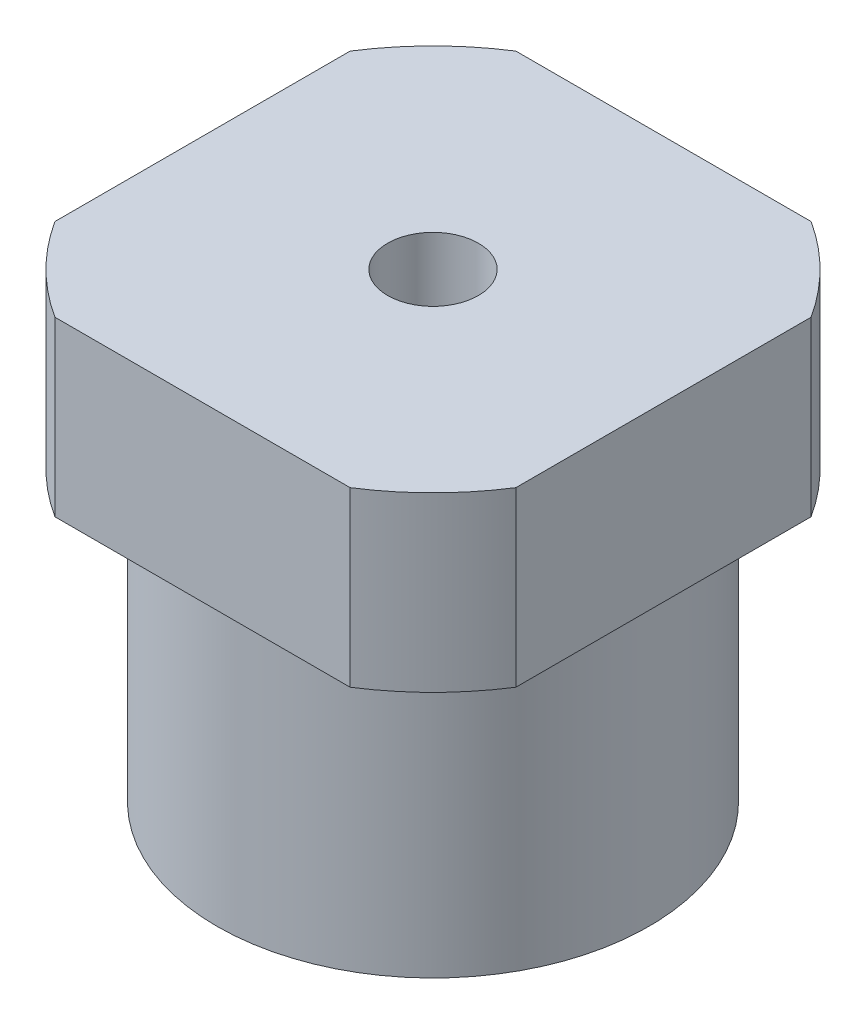
ISO-10303-21;
HEADER;
FILE_DESCRIPTION(('STEP AP214'),'2;1');
FILE_NAME('part.step','',(''),(''),'','','');
FILE_SCHEMA(('AUTOMOTIVE_DESIGN { 1 0 10303 214 1 1 1 1 }'));
ENDSEC;
DATA;
#1=APPLICATION_CONTEXT('core data for automotive mechanical design processes');
#2=APPLICATION_PROTOCOL_DEFINITION('international standard','automotive_design',2000,#1);
#3=PRODUCT_CONTEXT('',#1,'mechanical');
#4=PRODUCT('Part','Part','',(#3));
#5=PRODUCT_RELATED_PRODUCT_CATEGORY('part','',(#4));
#6=PRODUCT_DEFINITION_FORMATION('','',#4);
#7=PRODUCT_DEFINITION_CONTEXT('part definition',#1,'design');
#8=PRODUCT_DEFINITION('design','',#6,#7);
#9=PRODUCT_DEFINITION_SHAPE('','',#8);
#10=(LENGTH_UNIT() NAMED_UNIT(*) SI_UNIT(.MILLI.,.METRE.));
#11=(NAMED_UNIT(*) PLANE_ANGLE_UNIT() SI_UNIT($,.RADIAN.));
#12=(NAMED_UNIT(*) SI_UNIT($,.STERADIAN.) SOLID_ANGLE_UNIT());
#13=UNCERTAINTY_MEASURE_WITH_UNIT(LENGTH_MEASURE(1.E-05),#10,'distance_accuracy_value','');
#14=(GEOMETRIC_REPRESENTATION_CONTEXT(3) GLOBAL_UNCERTAINTY_ASSIGNED_CONTEXT((#13)) GLOBAL_UNIT_ASSIGNED_CONTEXT((#10,
#11,#12)) REPRESENTATION_CONTEXT('',''));
#15=CARTESIAN_POINT('',(0.,0.,0.));
#16=DIRECTION('',(0.,0.,1.));
#17=DIRECTION('',(1.,0.,0.));
#18=AXIS2_PLACEMENT_3D('',#15,#16,#17);
#19=CARTESIAN_POINT('',(10.16,20.32,-10.16));
#20=DIRECTION('',(-1.,0.,0.));
#21=DIRECTION('',(0.,0.,1.));
#22=AXIS2_PLACEMENT_3D('',#19,#20,#21);
#23=PLANE('',#22);
#24=DIRECTION('',(0.,1.,0.));
#25=VECTOR('',#24,1.);
#26=CARTESIAN_POINT('',(10.16,0.,6.50681373638434));
#27=LINE('',#26,#25);
#28=CARTESIAN_POINT('',(10.16,12.7,6.50681373638434));
#29=VERTEX_POINT('',#28);
#30=CARTESIAN_POINT('',(10.16,20.32,6.50681373638434));
#31=VERTEX_POINT('',#30);
#32=EDGE_CURVE('E109',#29,#31,#27,.T.);
#33=ORIENTED_EDGE('',*,*,#32,.F.);
#34=DIRECTION('',(0.,0.,-1.));
#35=VECTOR('',#34,1.);
#36=CARTESIAN_POINT('',(10.16,12.7,-10.16));
#37=LINE('',#36,#35);
#38=CARTESIAN_POINT('',(10.16,12.7,-6.50681373638434));
#39=VERTEX_POINT('',#38);
#40=EDGE_CURVE('E117',#29,#39,#37,.T.);
#41=ORIENTED_EDGE('',*,*,#40,.T.);
#42=DIRECTION('',(0.,1.,0.));
#43=VECTOR('',#42,1.);
#44=CARTESIAN_POINT('',(10.16,0.,-6.50681373638434));
#45=LINE('',#44,#43);
#46=CARTESIAN_POINT('',(10.16,20.32,-6.50681373638434));
#47=VERTEX_POINT('',#46);
#48=EDGE_CURVE('E101',#39,#47,#45,.T.);
#49=ORIENTED_EDGE('',*,*,#48,.T.);
#50=DIRECTION('',(0.,0.,-1.));
#51=VECTOR('',#50,1.);
#52=CARTESIAN_POINT('',(10.16,20.32,-10.16));
#53=LINE('',#52,#51);
#54=EDGE_CURVE('E115',#31,#47,#53,.T.);
#55=ORIENTED_EDGE('',*,*,#54,.F.);
#56=EDGE_LOOP('',(#33,#41,#49,#55));
#57=FACE_BOUND('',#56,.T.);
#58=ADVANCED_FACE('F35',(#57),#23,.F.);
#59=CARTESIAN_POINT('',(-10.16,20.32,-10.16));
#60=DIRECTION('',(0.,0.,1.));
#61=DIRECTION('',(1.,0.,0.));
#62=AXIS2_PLACEMENT_3D('',#59,#60,#61);
#63=PLANE('',#62);
#64=DIRECTION('',(0.,1.,0.));
#65=VECTOR('',#64,1.);
#66=CARTESIAN_POINT('',(6.50681373638434,0.,-10.16));
#67=LINE('',#66,#65);
#68=CARTESIAN_POINT('',(6.50681373638434,12.7,-10.16));
#69=VERTEX_POINT('',#68);
#70=CARTESIAN_POINT('',(6.50681373638434,20.32,-10.16));
#71=VERTEX_POINT('',#70);
#72=EDGE_CURVE('E104',#69,#71,#67,.T.);
#73=ORIENTED_EDGE('',*,*,#72,.F.);
#74=DIRECTION('',(-1.,0.,0.));
#75=VECTOR('',#74,1.);
#76=CARTESIAN_POINT('',(-10.16,12.7,-10.16));
#77=LINE('',#76,#75);
#78=CARTESIAN_POINT('',(-6.50681373638434,12.7,-10.16));
#79=VERTEX_POINT('',#78);
#80=EDGE_CURVE('E140',#69,#79,#77,.T.);
#81=ORIENTED_EDGE('',*,*,#80,.T.);
#82=DIRECTION('',(0.,1.,0.));
#83=VECTOR('',#82,1.);
#84=CARTESIAN_POINT('',(-6.50681373638434,0.,-10.16));
#85=LINE('',#84,#83);
#86=CARTESIAN_POINT('',(-6.50681373638434,20.32,-10.16));
#87=VERTEX_POINT('',#86);
#88=EDGE_CURVE('E50',#79,#87,#85,.T.);
#89=ORIENTED_EDGE('',*,*,#88,.T.);
#90=DIRECTION('',(-1.,0.,0.));
#91=VECTOR('',#90,1.);
#92=CARTESIAN_POINT('',(-10.16,20.32,-10.16));
#93=LINE('',#92,#91);
#94=EDGE_CURVE('E124',#71,#87,#93,.T.);
#95=ORIENTED_EDGE('',*,*,#94,.F.);
#96=EDGE_LOOP('',(#73,#81,#89,#95));
#97=FACE_BOUND('',#96,.T.);
#98=ADVANCED_FACE('F165',(#97),#63,.F.);
#99=CARTESIAN_POINT('',(-10.16,20.32,-10.16));
#100=DIRECTION('',(1.,0.,0.));
#101=DIRECTION('',(0.,0.,-1.));
#102=AXIS2_PLACEMENT_3D('',#99,#100,#101);
#103=PLANE('',#102);
#104=DIRECTION('',(0.,1.,0.));
#105=VECTOR('',#104,1.);
#106=CARTESIAN_POINT('',(-10.16,0.,6.50681373638435));
#107=LINE('',#106,#105);
#108=CARTESIAN_POINT('',(-10.16,12.7,6.50681373638435));
#109=VERTEX_POINT('',#108);
#110=CARTESIAN_POINT('',(-10.16,20.32,6.50681373638435));
#111=VERTEX_POINT('',#110);
#112=EDGE_CURVE('E57',#109,#111,#107,.T.);
#113=ORIENTED_EDGE('',*,*,#112,.T.);
#114=DIRECTION('',(0.,0.,1.));
#115=VECTOR('',#114,1.);
#116=CARTESIAN_POINT('',(-10.16,20.32,-10.16));
#117=LINE('',#116,#115);
#118=CARTESIAN_POINT('',(-10.16,20.32,-6.50681373638435));
#119=VERTEX_POINT('',#118);
#120=EDGE_CURVE('E127',#119,#111,#117,.T.);
#121=ORIENTED_EDGE('',*,*,#120,.F.);
#122=DIRECTION('',(0.,1.,0.));
#123=VECTOR('',#122,1.);
#124=CARTESIAN_POINT('',(-10.16,0.,-6.50681373638435));
#125=LINE('',#124,#123);
#126=CARTESIAN_POINT('',(-10.16,12.7,-6.50681373638435));
#127=VERTEX_POINT('',#126);
#128=EDGE_CURVE('E141',#127,#119,#125,.T.);
#129=ORIENTED_EDGE('',*,*,#128,.F.);
#130=DIRECTION('',(0.,0.,1.));
#131=VECTOR('',#130,1.);
#132=CARTESIAN_POINT('',(-10.16,12.7,-10.16));
#133=LINE('',#132,#131);
#134=EDGE_CURVE('E130',#127,#109,#133,.T.);
#135=ORIENTED_EDGE('',*,*,#134,.T.);
#136=EDGE_LOOP('',(#113,#121,#129,#135));
#137=FACE_BOUND('',#136,.T.);
#138=ADVANCED_FACE('F183',(#137),#103,.F.);
#139=CARTESIAN_POINT('',(-10.16,20.32,10.16));
#140=DIRECTION('',(0.,0.,-1.));
#141=DIRECTION('',(-1.,0.,0.));
#142=AXIS2_PLACEMENT_3D('',#139,#140,#141);
#143=PLANE('',#142);
#144=DIRECTION('',(0.,1.,0.));
#145=VECTOR('',#144,1.);
#146=CARTESIAN_POINT('',(-6.50681373638434,0.,10.16));
#147=LINE('',#146,#145);
#148=CARTESIAN_POINT('',(-6.50681373638434,12.7,10.16));
#149=VERTEX_POINT('',#148);
#150=CARTESIAN_POINT('',(-6.50681373638434,20.32,10.16));
#151=VERTEX_POINT('',#150);
#152=EDGE_CURVE('E172',#149,#151,#147,.T.);
#153=ORIENTED_EDGE('',*,*,#152,.F.);
#154=DIRECTION('',(1.,0.,0.));
#155=VECTOR('',#154,1.);
#156=CARTESIAN_POINT('',(-10.16,12.7,10.16));
#157=LINE('',#156,#155);
#158=CARTESIAN_POINT('',(6.50681373638434,12.7,10.16));
#159=VERTEX_POINT('',#158);
#160=EDGE_CURVE('E125',#149,#159,#157,.T.);
#161=ORIENTED_EDGE('',*,*,#160,.T.);
#162=DIRECTION('',(0.,1.,0.));
#163=VECTOR('',#162,1.);
#164=CARTESIAN_POINT('',(6.50681373638434,0.,10.16));
#165=LINE('',#164,#163);
#166=CARTESIAN_POINT('',(6.50681373638434,20.32,10.16));
#167=VERTEX_POINT('',#166);
#168=EDGE_CURVE('E158',#159,#167,#165,.T.);
#169=ORIENTED_EDGE('',*,*,#168,.T.);
#170=DIRECTION('',(1.,0.,0.));
#171=VECTOR('',#170,1.);
#172=CARTESIAN_POINT('',(-10.16,20.32,10.16));
#173=LINE('',#172,#171);
#174=EDGE_CURVE('E136',#151,#167,#173,.T.);
#175=ORIENTED_EDGE('',*,*,#174,.F.);
#176=EDGE_LOOP('',(#153,#161,#169,#175));
#177=FACE_BOUND('',#176,.T.);
#178=ADVANCED_FACE('F189',(#177),#143,.F.);
#179=CARTESIAN_POINT('',(0.,20.32,0.));
#180=DIRECTION('',(0.,1.,0.));
#181=DIRECTION('',(0.,0.,1.));
#182=AXIS2_PLACEMENT_3D('',#179,#180,#181);
#183=PLANE('',#182);
#184=CARTESIAN_POINT('',(0.,20.32,0.));
#185=DIRECTION('',(0.,1.,0.));
#186=DIRECTION('',(0.,0.,1.));
#187=AXIS2_PLACEMENT_3D('',#184,#185,#186);
#188=CIRCLE('',#187,2.000000064);
#189=CARTESIAN_POINT('',(0.,20.32,2.000000064));
#190=VERTEX_POINT('',#189);
#191=EDGE_CURVE('E222',#190,#190,#188,.T.);
#192=ORIENTED_EDGE('',*,*,#191,.F.);
#193=EDGE_LOOP('',(#192));
#194=FACE_BOUND('',#193,.T.);
#195=ORIENTED_EDGE('',*,*,#120,.T.);
#196=CARTESIAN_POINT('',(0.,20.32,0.));
#197=DIRECTION('',(0.,1.,0.));
#198=DIRECTION('',(0.,0.,1.));
#199=AXIS2_PLACEMENT_3D('',#196,#197,#198);
#200=CIRCLE('',#199,12.065);
#201=EDGE_CURVE('E175',#111,#151,#200,.T.);
#202=ORIENTED_EDGE('',*,*,#201,.T.);
#203=ORIENTED_EDGE('',*,*,#174,.T.);
#204=CARTESIAN_POINT('',(0.,20.32,0.));
#205=DIRECTION('',(0.,1.,0.));
#206=DIRECTION('',(0.,0.,1.));
#207=AXIS2_PLACEMENT_3D('',#204,#205,#206);
#208=CIRCLE('',#207,12.065);
#209=EDGE_CURVE('E123',#167,#31,#208,.T.);
#210=ORIENTED_EDGE('',*,*,#209,.T.);
#211=ORIENTED_EDGE('',*,*,#54,.T.);
#212=CARTESIAN_POINT('',(0.,20.32,0.));
#213=DIRECTION('',(0.,1.,0.));
#214=DIRECTION('',(0.,0.,1.));
#215=AXIS2_PLACEMENT_3D('',#212,#213,#214);
#216=CIRCLE('',#215,12.065);
#217=EDGE_CURVE('E98',#47,#71,#216,.T.);
#218=ORIENTED_EDGE('',*,*,#217,.T.);
#219=ORIENTED_EDGE('',*,*,#94,.T.);
#220=CARTESIAN_POINT('',(0.,20.32,0.));
#221=DIRECTION('',(0.,1.,0.));
#222=DIRECTION('',(0.,0.,1.));
#223=AXIS2_PLACEMENT_3D('',#220,#221,#222);
#224=CIRCLE('',#223,12.065);
#225=EDGE_CURVE('E166',#87,#119,#224,.T.);
#226=ORIENTED_EDGE('',*,*,#225,.T.);
#227=EDGE_LOOP('',(#195,#202,#203,#210,#211,#218,#219,#226));
#228=FACE_BOUND('',#227,.T.);
#229=ADVANCED_FACE('F121',(#194,#228),#183,.T.);
#230=CARTESIAN_POINT('',(0.,12.7,0.));
#231=DIRECTION('',(0.,1.,0.));
#232=DIRECTION('',(0.,0.,1.));
#233=AXIS2_PLACEMENT_3D('',#230,#231,#232);
#234=PLANE('',#233);
#235=CARTESIAN_POINT('',(0.,12.7,0.));
#236=DIRECTION('',(0.,1.,0.));
#237=DIRECTION('',(0.,0.,1.));
#238=AXIS2_PLACEMENT_3D('',#235,#236,#237);
#239=CIRCLE('',#238,9.525);
#240=CARTESIAN_POINT('',(0.,12.7,9.525));
#241=VERTEX_POINT('',#240);
#242=EDGE_CURVE('E146',#241,#241,#239,.T.);
#243=ORIENTED_EDGE('',*,*,#242,.T.);
#244=EDGE_LOOP('',(#243));
#245=FACE_BOUND('',#244,.T.);
#246=CARTESIAN_POINT('',(0.,12.7,0.));
#247=DIRECTION('',(0.,1.,0.));
#248=DIRECTION('',(0.,0.,1.));
#249=AXIS2_PLACEMENT_3D('',#246,#247,#248);
#250=CIRCLE('',#249,12.065);
#251=EDGE_CURVE('E11',#109,#149,#250,.T.);
#252=ORIENTED_EDGE('',*,*,#251,.F.);
#253=ORIENTED_EDGE('',*,*,#134,.F.);
#254=CARTESIAN_POINT('',(0.,12.7,0.));
#255=DIRECTION('',(0.,1.,0.));
#256=DIRECTION('',(0.,0.,1.));
#257=AXIS2_PLACEMENT_3D('',#254,#255,#256);
#258=CIRCLE('',#257,12.065);
#259=EDGE_CURVE('E149',#79,#127,#258,.T.);
#260=ORIENTED_EDGE('',*,*,#259,.F.);
#261=ORIENTED_EDGE('',*,*,#80,.F.);
#262=CARTESIAN_POINT('',(0.,12.7,0.));
#263=DIRECTION('',(0.,1.,0.));
#264=DIRECTION('',(0.,0.,1.));
#265=AXIS2_PLACEMENT_3D('',#262,#263,#264);
#266=CIRCLE('',#265,12.065);
#267=EDGE_CURVE('E153',#39,#69,#266,.T.);
#268=ORIENTED_EDGE('',*,*,#267,.F.);
#269=ORIENTED_EDGE('',*,*,#40,.F.);
#270=CARTESIAN_POINT('',(0.,12.7,0.));
#271=DIRECTION('',(0.,1.,0.));
#272=DIRECTION('',(0.,0.,1.));
#273=AXIS2_PLACEMENT_3D('',#270,#271,#272);
#274=CIRCLE('',#273,12.065);
#275=EDGE_CURVE('E43',#159,#29,#274,.T.);
#276=ORIENTED_EDGE('',*,*,#275,.F.);
#277=ORIENTED_EDGE('',*,*,#160,.F.);
#278=EDGE_LOOP('',(#252,#253,#260,#261,#268,#269,#276,#277));
#279=FACE_BOUND('',#278,.T.);
#280=ADVANCED_FACE('F162',(#245,#279),#234,.F.);
#281=CARTESIAN_POINT('',(0.,12.7,0.));
#282=DIRECTION('',(0.,-1.,0.));
#283=DIRECTION('',(0.,0.,-1.));
#284=AXIS2_PLACEMENT_3D('',#281,#282,#283);
#285=CYLINDRICAL_SURFACE('',#284,9.525);
#286=ORIENTED_EDGE('',*,*,#242,.F.);
#287=EDGE_LOOP('',(#286));
#288=FACE_BOUND('',#287,.T.);
#289=CARTESIAN_POINT('',(0.,0.,0.));
#290=DIRECTION('',(0.,1.,0.));
#291=DIRECTION('',(0.,0.,1.));
#292=AXIS2_PLACEMENT_3D('',#289,#290,#291);
#293=CIRCLE('',#292,9.525);
#294=CARTESIAN_POINT('',(0.,0.,9.525));
#295=VERTEX_POINT('',#294);
#296=EDGE_CURVE('E138',#295,#295,#293,.T.);
#297=ORIENTED_EDGE('',*,*,#296,.T.);
#298=EDGE_LOOP('',(#297));
#299=FACE_BOUND('',#298,.T.);
#300=ADVANCED_FACE('F37',(#288,#299),#285,.T.);
#301=CARTESIAN_POINT('',(0.,0.,0.));
#302=DIRECTION('',(0.,1.,0.));
#303=DIRECTION('',(0.,0.,1.));
#304=AXIS2_PLACEMENT_3D('',#301,#302,#303);
#305=PLANE('',#304);
#306=CARTESIAN_POINT('',(0.,0.,0.));
#307=DIRECTION('',(0.,1.,0.));
#308=DIRECTION('',(0.,0.,1.));
#309=AXIS2_PLACEMENT_3D('',#306,#307,#308);
#310=CIRCLE('',#309,2.000000064);
#311=CARTESIAN_POINT('',(0.,0.,2.000000064));
#312=VERTEX_POINT('',#311);
#313=EDGE_CURVE('E178',#312,#312,#310,.T.);
#314=ORIENTED_EDGE('',*,*,#313,.T.);
#315=EDGE_LOOP('',(#314));
#316=FACE_BOUND('',#315,.T.);
#317=ORIENTED_EDGE('',*,*,#296,.F.);
#318=EDGE_LOOP('',(#317));
#319=FACE_BOUND('',#318,.T.);
#320=ADVANCED_FACE('F206',(#316,#319),#305,.F.);
#321=CARTESIAN_POINT('',(0.,0.,0.));
#322=DIRECTION('',(0.,1.,0.));
#323=DIRECTION('',(0.,0.,1.));
#324=AXIS2_PLACEMENT_3D('',#321,#322,#323);
#325=CYLINDRICAL_SURFACE('',#324,12.065);
#326=ORIENTED_EDGE('',*,*,#259,.T.);
#327=ORIENTED_EDGE('',*,*,#128,.T.);
#328=ORIENTED_EDGE('',*,*,#225,.F.);
#329=ORIENTED_EDGE('',*,*,#88,.F.);
#330=EDGE_LOOP('',(#326,#327,#328,#329));
#331=FACE_BOUND('',#330,.T.);
#332=ADVANCED_FACE('F208',(#331),#325,.T.);
#333=CARTESIAN_POINT('',(0.,0.,0.));
#334=DIRECTION('',(0.,1.,0.));
#335=DIRECTION('',(0.,0.,1.));
#336=AXIS2_PLACEMENT_3D('',#333,#334,#335);
#337=CYLINDRICAL_SURFACE('',#336,12.065);
#338=ORIENTED_EDGE('',*,*,#267,.T.);
#339=ORIENTED_EDGE('',*,*,#72,.T.);
#340=ORIENTED_EDGE('',*,*,#217,.F.);
#341=ORIENTED_EDGE('',*,*,#48,.F.);
#342=EDGE_LOOP('',(#338,#339,#340,#341));
#343=FACE_BOUND('',#342,.T.);
#344=ADVANCED_FACE('F100',(#343),#337,.T.);
#345=CARTESIAN_POINT('',(0.,0.,0.));
#346=DIRECTION('',(0.,1.,0.));
#347=DIRECTION('',(0.,0.,1.));
#348=AXIS2_PLACEMENT_3D('',#345,#346,#347);
#349=CYLINDRICAL_SURFACE('',#348,12.065);
#350=ORIENTED_EDGE('',*,*,#275,.T.);
#351=ORIENTED_EDGE('',*,*,#32,.T.);
#352=ORIENTED_EDGE('',*,*,#209,.F.);
#353=ORIENTED_EDGE('',*,*,#168,.F.);
#354=EDGE_LOOP('',(#350,#351,#352,#353));
#355=FACE_BOUND('',#354,.T.);
#356=ADVANCED_FACE('F156',(#355),#349,.T.);
#357=CARTESIAN_POINT('',(0.,0.,0.));
#358=DIRECTION('',(0.,1.,0.));
#359=DIRECTION('',(0.,0.,1.));
#360=AXIS2_PLACEMENT_3D('',#357,#358,#359);
#361=CYLINDRICAL_SURFACE('',#360,12.065);
#362=ORIENTED_EDGE('',*,*,#251,.T.);
#363=ORIENTED_EDGE('',*,*,#152,.T.);
#364=ORIENTED_EDGE('',*,*,#201,.F.);
#365=ORIENTED_EDGE('',*,*,#112,.F.);
#366=EDGE_LOOP('',(#362,#363,#364,#365));
#367=FACE_BOUND('',#366,.T.);
#368=ADVANCED_FACE('F186',(#367),#361,.T.);
#369=CARTESIAN_POINT('',(0.,0.,0.));
#370=DIRECTION('',(0.,1.,0.));
#371=DIRECTION('',(0.,0.,1.));
#372=AXIS2_PLACEMENT_3D('',#369,#370,#371);
#373=CYLINDRICAL_SURFACE('',#372,2.000000064);
#374=ORIENTED_EDGE('',*,*,#313,.F.);
#375=EDGE_LOOP('',(#374));
#376=FACE_BOUND('',#375,.T.);
#377=ORIENTED_EDGE('',*,*,#191,.T.);
#378=EDGE_LOOP('',(#377));
#379=FACE_BOUND('',#378,.T.);
#380=ADVANCED_FACE('F227',(#376,#379),#373,.F.);
#381=CLOSED_SHELL('',(#58,#98,#138,#178,#229,#280,#300,#320,#332,#344,#356,#368,#380));
#382=MANIFOLD_SOLID_BREP('B2',#381);
#383=ADVANCED_BREP_SHAPE_REPRESENTATION('',(#18,#382),#14);
#384=SHAPE_DEFINITION_REPRESENTATION(#9,#383);
ENDSEC;
END-ISO-10303-21;
